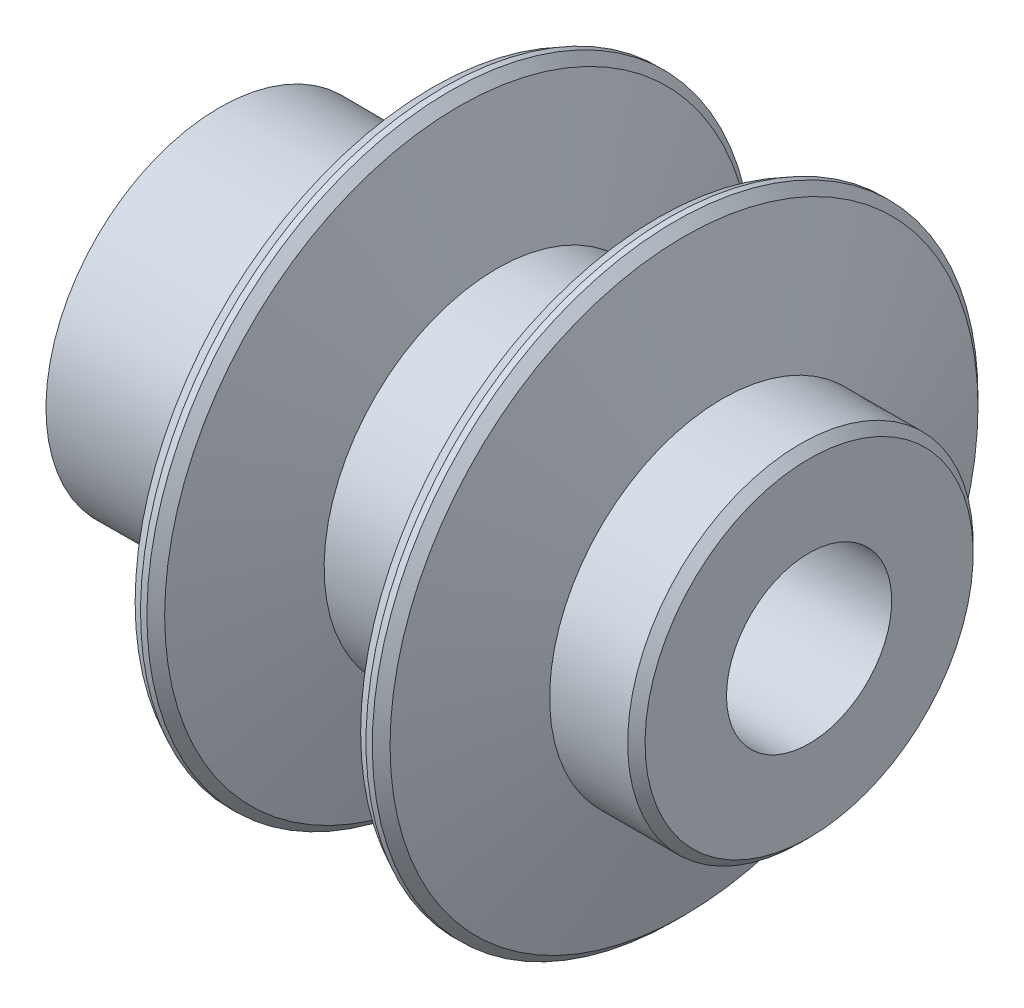
ISO-10303-21;
HEADER;
FILE_DESCRIPTION(('STEP AP214'),'2;1');
FILE_NAME('part.step','',(''),(''),'','','');
FILE_SCHEMA(('AUTOMOTIVE_DESIGN { 1 0 10303 214 1 1 1 1 }'));
ENDSEC;
DATA;
#1=APPLICATION_CONTEXT('core data for automotive mechanical design processes');
#2=APPLICATION_PROTOCOL_DEFINITION('international standard','automotive_design',2000,#1);
#3=PRODUCT_CONTEXT('',#1,'mechanical');
#4=PRODUCT('Part','Part','',(#3));
#5=PRODUCT_RELATED_PRODUCT_CATEGORY('part','',(#4));
#6=PRODUCT_DEFINITION_FORMATION('','',#4);
#7=PRODUCT_DEFINITION_CONTEXT('part definition',#1,'design');
#8=PRODUCT_DEFINITION('design','',#6,#7);
#9=PRODUCT_DEFINITION_SHAPE('','',#8);
#10=(LENGTH_UNIT() NAMED_UNIT(*) SI_UNIT(.MILLI.,.METRE.));
#11=(NAMED_UNIT(*) PLANE_ANGLE_UNIT() SI_UNIT($,.RADIAN.));
#12=(NAMED_UNIT(*) SI_UNIT($,.STERADIAN.) SOLID_ANGLE_UNIT());
#13=UNCERTAINTY_MEASURE_WITH_UNIT(LENGTH_MEASURE(1.E-05),#10,'distance_accuracy_value','');
#14=(GEOMETRIC_REPRESENTATION_CONTEXT(3) GLOBAL_UNCERTAINTY_ASSIGNED_CONTEXT((#13)) GLOBAL_UNIT_ASSIGNED_CONTEXT((#10,
#11,#12)) REPRESENTATION_CONTEXT('',''));
#15=CARTESIAN_POINT('',(0.,0.,0.));
#16=DIRECTION('',(0.,0.,1.));
#17=DIRECTION('',(1.,0.,0.));
#18=AXIS2_PLACEMENT_3D('',#15,#16,#17);
#19=CARTESIAN_POINT('',(-45.4027060929617,10.261092972109,0.));
#20=DIRECTION('',(0.99999999089214,0.000134965623412238,0.));
#21=DIRECTION('',(-0.000134965623412238,0.99999999089214,0.));
#22=AXIS2_PLACEMENT_3D('',#19,#20,#21);
#23=CONICAL_SURFACE('',#22,19.9999998178471,1.57066136117108);
#24=CARTESIAN_POINT('',(-45.4027060929617,10.261092972109,0.));
#25=DIRECTION('',(0.99999999089214,0.000134965623412238,0.));
#26=DIRECTION('',(-0.000134965623412238,0.99999999089214,0.));
#27=AXIS2_PLACEMENT_3D('',#24,#25,#26);
#28=CIRCLE('',#27,19.9999998178471);
#29=CARTESIAN_POINT('',(-45.4054054054054,30.2610926077989,0.));
#30=VERTEX_POINT('',#29);
#31=EDGE_CURVE('E80',#30,#30,#28,.T.);
#32=ORIENTED_EDGE('',*,*,#31,.F.);
#33=EDGE_LOOP('',(#32));
#34=FACE_BOUND('',#33,.T.);
#35=CARTESIAN_POINT('',(-45.4030737646995,2.51028127781917,-5.53629377175055));
#36=CARTESIAN_POINT('',(-45.403094757583,2.66582371932719,-5.7540564947995));
#37=CARTESIAN_POINT('',(-45.4031169875221,2.83053186984287,-5.9652335591642));
#38=CARTESIAN_POINT('',(-45.4031637751912,3.17719545691837,-6.37304072005153));
#39=CARTESIAN_POINT('',(-45.4031883335321,3.35915542005099,-6.56966697446681));
#40=CARTESIAN_POINT('',(-45.4032396245651,3.73918575412125,-6.94709710749086));
#41=CARTESIAN_POINT('',(-45.4032663595472,3.9372730919732,-7.12788389601905));
#42=CARTESIAN_POINT('',(-45.403321791674,4.34798600700947,-7.47212087167371));
#43=CARTESIAN_POINT('',(-45.4033504888534,4.56061184140798,-7.6355707519461));
#44=CARTESIAN_POINT('',(-45.4034096259314,4.99877582943607,-7.94388912346982));
#45=CARTESIAN_POINT('',(-45.4034400649606,5.22430754107116,-8.08876677007018));
#46=CARTESIAN_POINT('',(-45.4035024827213,5.68677907162685,-8.35900765826846));
#47=CARTESIAN_POINT('',(-45.4035344614771,5.92371907064133,-8.48437059167025));
#48=CARTESIAN_POINT('',(-45.4035997227812,6.40725925021572,-8.71465931155335));
#49=CARTESIAN_POINT('',(-45.4036330050066,6.65385703850355,-8.8195901211724));
#50=CARTESIAN_POINT('',(-45.4037006433634,7.15500950129093,-9.00830522172377));
#51=CARTESIAN_POINT('',(-45.403734999472,7.40956400586544,-9.09208996390897));
#52=CARTESIAN_POINT('',(-45.4038045460873,7.92485531718505,-9.23792872252882));
#53=CARTESIAN_POINT('',(-45.4038397366896,8.18559283154042,-9.29998023877936));
#54=CARTESIAN_POINT('',(-45.4039106983418,8.7113685679401,-9.40189807017984));
#55=CARTESIAN_POINT('',(-45.4039464693923,8.97640679434254,-9.44176436284696));
#56=CARTESIAN_POINT('',(-45.4040183390069,9.50890989112152,-9.4990293531274));
#57=CARTESIAN_POINT('',(-45.4040544375836,9.77637485555073,-9.51642717615611));
#58=CARTESIAN_POINT('',(-45.4041267042188,10.3118195960846,-9.52862866563136));
#59=CARTESIAN_POINT('',(-45.4041628722773,10.5797993720884,-9.5234323365014));
#60=CARTESIAN_POINT('',(-45.4042350200699,11.1143635734892,-9.4904827837582));
#61=CARTESIAN_POINT('',(-45.4042709998074,11.3809480246983,-9.46272997891086));
#62=CARTESIAN_POINT('',(-45.4043425158413,11.9108313411168,-9.38486531181616));
#63=CARTESIAN_POINT('',(-45.4043780521377,12.1741302062658,-9.33475344915659));
#64=CARTESIAN_POINT('',(-45.4044484285746,12.6955699150398,-9.21252705620526));
#65=CARTESIAN_POINT('',(-45.4044832687167,12.9537107690989,-9.14041257042716));
#66=CARTESIAN_POINT('',(-45.4045520052273,13.4629997815399,-8.97469358643707));
#67=CARTESIAN_POINT('',(-45.4045859015958,13.7141479399298,-8.8810890882499));
#68=CARTESIAN_POINT('',(-45.4046525096404,14.2076665234775,-8.67305535102246));
#69=CARTESIAN_POINT('',(-45.4046852213143,14.4500369318717,-8.55862607221405));
#70=CARTESIAN_POINT('',(-45.4047492273408,14.9242763986454,-8.30975641802208));
#71=CARTESIAN_POINT('',(-45.4047805216934,15.156145457028,-8.17531604264423));
#72=CARTESIAN_POINT('',(-45.4048414705377,15.6077333629814,-7.88738024761729));
#73=CARTESIAN_POINT('',(-45.4048711250324,15.8274522324759,-7.73388486235241));
#74=CARTESIAN_POINT('',(-45.4049285833966,16.2531781454162,-7.4089301147263));
#75=CARTESIAN_POINT('',(-45.404956387266,16.4591851888786,-7.23747075238695));
#76=CARTESIAN_POINT('',(-45.4050099467212,16.8560229388731,-6.87780695543337));
#77=CARTESIAN_POINT('',(-45.4050357023061,17.0468536398268,-6.68960251466423));
#78=CARTESIAN_POINT('',(-45.4050849820741,17.4119819302732,-6.29778663389506));
#79=CARTESIAN_POINT('',(-45.4051085062572,17.586279519744,-6.0941751938747));
#80=CARTESIAN_POINT('',(-45.4051531560027,17.9171026117396,-5.67299264580523));
#81=CARTESIAN_POINT('',(-45.4051742815624,18.0736280954866,-5.45542152300689));
#82=CARTESIAN_POINT('',(-45.4052139838422,18.3677939598887,-5.00786660447967));
#83=CARTESIAN_POINT('',(-45.4052325605622,18.5054343405343,-4.77788280874449));
#84=CARTESIAN_POINT('',(-45.4052670330871,18.7608514141752,-4.30713767201588));
#85=CARTESIAN_POINT('',(-45.405282928893,18.8786281138192,-4.06637633462997));
#86=CARTESIAN_POINT('',(-45.4053119265876,19.093480559322,-3.57578771265257));
#87=CARTESIAN_POINT('',(-45.4053250284763,19.190556305196,-3.32596042806774));
#88=CARTESIAN_POINT('',(-45.4053483451852,19.3633166575163,-2.81901613740866));
#89=CARTESIAN_POINT('',(-45.4053585600065,19.4390012726286,-2.56189913428761));
#90=CARTESIAN_POINT('',(-45.4053760299666,19.5684413437185,-2.04220325681223));
#91=CARTESIAN_POINT('',(-45.4053832851053,19.6221967996988,-1.77962438245855));
#92=CARTESIAN_POINT('',(-45.4053947841211,19.7073963890895,-1.25087150594821));
#93=CARTESIAN_POINT('',(-45.4053990279978,19.7388405196073,-0.984697503325427));
#94=CARTESIAN_POINT('',(-45.4054044743167,19.779193897851,-0.450646741045923));
#95=CARTESIAN_POINT('',(-45.4054056767589,19.7881031455715,-0.182769981388778));
#96=CARTESIAN_POINT('',(-45.40540503166,19.7833234184803,0.352781886933116));
#97=CARTESIAN_POINT('',(-45.4054031841186,19.769634440714,0.620456995571493));
#98=CARTESIAN_POINT('',(-45.4053964521867,19.7197555774943,1.15370251684772));
#99=CARTESIAN_POINT('',(-45.4053915677962,19.6835656920403,1.4192729294855));
#100=CARTESIAN_POINT('',(-45.4053787968915,19.5889423040728,1.94642099988044));
#101=CARTESIAN_POINT('',(-45.4053709103775,19.5305088025799,2.20799865782078));
#102=CARTESIAN_POINT('',(-45.4053521912941,19.3918136096325,2.72530157077349));
#103=CARTESIAN_POINT('',(-45.4053413587248,19.3115519181798,2.98102682578633));
#104=CARTESIAN_POINT('',(-45.4053168245444,19.129770962005,3.48480686812141));
#105=CARTESIAN_POINT('',(-45.4053031229336,19.0282516982411,3.73286165578941));
#106=CARTESIAN_POINT('',(-45.4052729480801,18.804677336399,4.21953725467747));
#107=CARTESIAN_POINT('',(-45.4052564748375,18.6826222383212,4.45815806589776));
#108=CARTESIAN_POINT('',(-45.4052208738355,18.4188439460777,4.92426926167932));
#109=CARTESIAN_POINT('',(-45.405201746076,18.2771207518553,5.15175964620856));
#110=CARTESIAN_POINT('',(-45.4051609720271,17.9750138345718,5.59399266765372));
#111=CARTESIAN_POINT('',(-45.4051393257376,17.8146301115102,5.80873530456929));
#112=CARTESIAN_POINT('',(-45.4050936685199,17.4763423610621,6.22394614878832));
#113=CARTESIAN_POINT('',(-45.4050696575915,17.2984383328852,6.42441435544792));
#114=CARTESIAN_POINT('',(-45.4050194418,16.9263747693751,6.80965111965927));
#115=CARTESIAN_POINT('',(-45.4049932369369,16.7322152340405,6.99441967720971));
#116=CARTESIAN_POINT('',(-45.4049388195754,16.3290210040934,7.34694355834154));
#117=CARTESIAN_POINT('',(-45.404910607077,16.1199863087317,7.51469888106593));
#118=CARTESIAN_POINT('',(-45.4048523750201,15.6885278790457,7.83200364200228));
#119=CARTESIAN_POINT('',(-45.4048223554616,15.4661041447219,7.9815530802148));
#120=CARTESIAN_POINT('',(-45.4047607227097,15.0094489666934,8.26138284683793));
#121=CARTESIAN_POINT('',(-45.4047291095165,14.7752175245324,8.39166317776779));
#122=CARTESIAN_POINT('',(-45.4046645142424,14.2966121490654,8.63202853823916));
#123=CARTESIAN_POINT('',(-45.4046315321615,14.0522382157619,8.74211356778563));
#124=CARTESIAN_POINT('',(-45.4045644335991,13.5550852419095,8.94130567427798));
#125=CARTESIAN_POINT('',(-45.4045303171177,13.3023062024397,9.03041275391717));
#126=CARTESIAN_POINT('',(-45.404461192298,12.7901400932492,9.18701548114189));
#127=CARTESIAN_POINT('',(-45.4044261839596,12.5307530235275,9.25451112872477));
#128=CARTESIAN_POINT('',(-45.4043555242998,12.0072148335738,9.36741116131099));
#129=CARTESIAN_POINT('',(-45.404319872978,11.7430637114117,9.41281553736489));
#130=CARTESIAN_POINT('',(-45.4042481808249,11.2118754756744,9.4812101880904));
#131=CARTESIAN_POINT('',(-45.4042121399934,10.944838362097,9.50420046274556));
#132=CARTESIAN_POINT('',(-45.4041399250377,10.4097765293485,9.52760346738028));
#133=CARTESIAN_POINT('',(-45.4041037509133,10.1417518098493,9.52801618985955));
#134=CARTESIAN_POINT('',(-45.4040315265603,9.6066203508181,9.50626113700611));
#135=CARTESIAN_POINT('',(-45.4039954763317,9.33951361128573,9.48409336168486));
#136=CARTESIAN_POINT('',(-45.4039237561038,8.80811736400552,9.4173349483631));
#137=CARTESIAN_POINT('',(-45.4038880861041,8.54382785328131,9.37274433405449));
#138=CARTESIAN_POINT('',(-45.4038173798876,8.0199447149835,9.26145726712772));
#139=CARTESIAN_POINT('',(-45.4037823436707,7.76035108740369,9.19476081453883));
#140=CARTESIAN_POINT('',(-45.4037131541187,7.24770536397686,9.03973627125231));
#141=CARTESIAN_POINT('',(-45.4036790007834,6.99465326569139,8.95140818861831));
#142=CARTESIAN_POINT('',(-45.4036118197903,6.4968895456792,8.75374833099488));
#143=CARTESIAN_POINT('',(-45.4035787921326,6.25217792396261,8.64441655597991));
#144=CARTESIAN_POINT('',(-45.4035140972428,5.77283447438718,8.40552637981803));
#145=CARTESIAN_POINT('',(-45.4034824300132,5.53820266471732,8.27596794217412));
#146=CARTESIAN_POINT('',(-45.4034206811784,5.08068740311404,7.99754566787315));
#147=CARTESIAN_POINT('',(-45.4033905995733,4.85780395118392,7.84868183121066));
#148=CARTESIAN_POINT('',(-45.4033322359059,4.42537039026196,7.53270739638794));
#149=CARTESIAN_POINT('',(-45.4033039538403,4.21582025573391,7.36559683317582));
#150=CARTESIAN_POINT('',(-45.4032493902573,3.81154263678411,7.01431676583025));
#151=CARTESIAN_POINT('',(-45.4032231087399,3.61681515237941,6.83014726167716));
#152=CARTESIAN_POINT('',(-45.4031727330479,3.24356684890642,6.44605825547448));
#153=CARTESIAN_POINT('',(-45.4031486388777,3.06504606262618,6.24613872156226));
#154=CARTESIAN_POINT('',(-45.4031028092359,2.72548078138441,5.83197129710767));
#155=CARTESIAN_POINT('',(-45.4030810737643,2.56443628610066,5.6177234068295));
#156=CARTESIAN_POINT('',(-45.4030401156652,2.26096569597363,5.1764183432156));
#157=CARTESIAN_POINT('',(-45.4030208930843,2.1185399467729,4.94936093219308));
#158=CARTESIAN_POINT('',(-45.4029850979034,1.85332293481566,4.48405470800198));
#159=CARTESIAN_POINT('',(-45.4029685253039,1.73053167590312,4.24580589264241));
#160=CARTESIAN_POINT('',(-45.4029381485078,1.50546106918331,3.75982024607018));
#161=CARTESIAN_POINT('',(-45.4029243442035,1.40318092319154,3.51208378451375));
#162=CARTESIAN_POINT('',(-45.4028996013393,1.21985377269812,3.00887555235811));
#163=CARTESIAN_POINT('',(-45.4028886627764,1.13880674667868,2.7534037895982));
#164=CARTESIAN_POINT('',(-45.40286973023,0.998529948043019,2.23657064577719));
#165=CARTESIAN_POINT('',(-45.402861735908,0.939297667761671,1.97520994533336));
#166=CARTESIAN_POINT('',(-45.4028487467561,0.843057225260696,1.44842255267739));
#167=CARTESIAN_POINT('',(-45.4028437519902,0.806049537376598,1.18299577380764));
#168=CARTESIAN_POINT('',(-45.4028367968657,0.754516976990006,0.649902541356219));
#169=CARTESIAN_POINT('',(-45.4028348372546,0.739997642381337,0.382235552419567));
#170=CARTESIAN_POINT('',(-45.4028339687266,0.733562463632602,-0.153365644252848));
#171=CARTESIAN_POINT('',(-45.4028350597616,0.741646262560721,-0.421299847702171));
#172=CARTESIAN_POINT('',(-45.4028402859876,0.780368906351694,-0.955667186808613));
#173=CARTESIAN_POINT('',(-45.4028444226856,0.811018916493242,-1.22209951358983));
#174=CARTESIAN_POINT('',(-45.4028557123142,0.894667092141308,-1.75142660780409));
#175=CARTESIAN_POINT('',(-45.4028628651916,0.94766486216087,-2.01432143775504));
#176=CARTESIAN_POINT('',(-45.4028801274317,1.07556587008988,-2.53443477894393));
#177=CARTESIAN_POINT('',(-45.402890233638,1.15044572155418,-2.79165903658473));
#178=CARTESIAN_POINT('',(-45.4029133291722,1.3215673195067,-3.29880765042695));
#179=CARTESIAN_POINT('',(-45.402926317741,1.41780344171262,-3.54873390902003));
#180=CARTESIAN_POINT('',(-45.4029586730364,1.65753333128402,-4.10073641131244));
#181=CARTESIAN_POINT('',(-45.4029788226328,1.80682761143724,-4.40031281790049));
#182=CARTESIAN_POINT('',(-45.4030232599329,2.13607662346845,-4.98211448869472));
#183=CARTESIAN_POINT('',(-45.4030475476365,2.31603135534617,-5.26433975290104));
#184=CARTESIAN_POINT('',(-45.4030737646995,2.51028127781917,-5.53629377175055));
#185=B_SPLINE_CURVE_WITH_KNOTS('',3,(#35,#36,#37,#38,#39,#40,#41,#42,#43,#44,#45,#46,#47,#48,
#49,#50,#51,#52,#53,#54,#55,#56,#57,#58,#59,#60,#61,#62,#63,#64,#65,#66,#67,#68,#69,#70,#71,#72,
#73,#74,#75,#76,#77,#78,#79,#80,#81,#82,#83,#84,#85,#86,#87,#88,#89,#90,#91,#92,#93,#94,#95,#96,
#97,#98,#99,#100,#101,#102,#103,#104,#105,#106,#107,#108,#109,#110,#111,#112,#113,#114,#115,
#116,#117,#118,#119,#120,#121,#122,#123,#124,#125,#126,#127,#128,#129,#130,#131,#132,#133,#134,
#135,#136,#137,#138,#139,#140,#141,#142,#143,#144,#145,#146,#147,#148,#149,#150,#151,#152,#153,
#154,#155,#156,#157,#158,#159,#160,#161,#162,#163,#164,#165,#166,#167,#168,#169,#170,#171,#172,
#173,#174,#175,#176,#177,#178,#179,#180,#181,#182,#183,#184),.UNSPECIFIED.,.T.,.F.,(4,2,2,2,2,2,
2,2,2,2,2,2,2,2,2,2,2,2,2,2,2,2,2,2,2,2,2,2,2,2,2,2,2,2,2,2,2,2,2,2,2,2,2,2,2,2,2,2,2,2,2,2,2,2,
2,2,2,2,2,2,2,2,2,2,2,2,2,2,2,2,2,2,2,2,4),(0.,0.802532149334454,1.6052754548481,
2.40887448425916,3.21248773457417,4.01570330056762,4.81893155046903,5.62196208062227,
6.42497547281391,7.22808121311841,8.03118776730027,8.8343255814422,9.63746323834596,
10.4405859851645,11.2437087467896,12.0468298836224,12.8499510195278,13.653073689133,
14.4561963585088,15.2593175786938,16.0624387979001,16.8655603123074,17.6686818277752,
18.471804191802,19.2749265562358,20.0780486518455,20.8811707468634,21.6842925165246,
22.4874142860892,23.29053615978,24.0936580336679,24.8967800125686,25.699901991497,
26.5030239335806,27.3061458755991,28.1092677814138,28.9123896872097,29.715511595318,
30.5186335034484,31.3217554478038,32.1248773922265,32.9279993771054,33.7311213619596,
34.5342432418128,35.3373651214691,36.1404868980143,36.9436086746577,37.746730776655,
38.5498528792421,39.3529752486275,40.156097617605,40.9592191380074,41.7623406573463,
42.565461877305,43.3685830982395,44.1717057683427,44.9748284386721,45.7779495708014,
46.5810707038547,47.3841934616805,48.1873162046983,48.9904538549489,49.7935916624351,
50.5966982099597,51.3998039436074,52.2028173292021,53.0058478527599,53.809076096047,
54.6122916554248,55.4159048959808,56.2195039156387,57.0222472114499,57.8247793510958,
58.8270254665628,59.8292715820211),.UNSPECIFIED.);
#186=CARTESIAN_POINT('',(-45.4030737646995,2.51028127781917,-5.53629377175055));
#187=VERTEX_POINT('',#186);
#188=EDGE_CURVE('E88',#187,#187,#185,.T.);
#189=ORIENTED_EDGE('',*,*,#188,.T.);
#190=EDGE_LOOP('',(#189));
#191=FACE_BOUND('',#190,.T.);
#192=ADVANCED_FACE('F42',(#34,#191),#23,.T.);
#193=CARTESIAN_POINT('',(22.5945945946021,10.2702702702703,0.));
#194=DIRECTION('',(0.99999999089214,0.000134965623412238,0.));
#195=DIRECTION('',(-0.000134965623412238,0.99999999089214,0.));
#196=AXIS2_PLACEMENT_3D('',#193,#194,#195);
#197=CONICAL_SURFACE('',#196,0.,1.57066136117107);
#198=CARTESIAN_POINT('',(22.5971481527377,10.2702706149128,0.));
#199=DIRECTION('',(-0.99999999089214,-0.000134965623409413,0.));
#200=DIRECTION('',(0.000134965623409413,-0.99999999089214,0.));
#201=AXIS2_PLACEMENT_3D('',#198,#199,#200);
#202=CIRCLE('',#201,18.9200632795988);
#203=CARTESIAN_POINT('',(22.5997017108731,-8.64979249236463,0.));
#204=VERTEX_POINT('',#203);
#205=EDGE_CURVE('E77',#204,#204,#202,.F.);
#206=ORIENTED_EDGE('',*,*,#205,.T.);
#207=EDGE_LOOP('',(#206));
#208=FACE_BOUND('',#207,.T.);
#209=CARTESIAN_POINT('',(22.5969284821206,2.51028127839455,-5.53629377256313));
#210=CARTESIAN_POINT('',(22.596949495638,2.35473571286341,-5.31853328302294));
#211=CARTESIAN_POINT('',(22.596969265962,2.20839248666329,-5.09423841748999));
#212=CARTESIAN_POINT('',(22.5970061919177,1.93506039358879,-4.63405162151986));
#213=CARTESIAN_POINT('',(22.5970233468601,1.80807662921729,-4.39815665527868));
#214=CARTESIAN_POINT('',(22.5970549288809,1.57430120961579,-3.91625872905726));
#215=CARTESIAN_POINT('',(22.597069353032,1.46753122345851,-3.6702452620231));
#216=CARTESIAN_POINT('',(22.597095348846,1.27510584342714,-3.17008862075407));
#217=CARTESIAN_POINT('',(22.5971069204584,1.18945082324096,-2.91594530272885));
#218=CARTESIAN_POINT('',(22.5971271233595,1.03990555169681,-2.40147070727027));
#219=CARTESIAN_POINT('',(22.5971357561005,0.976004550547644,-2.14114255432202));
#220=CARTESIAN_POINT('',(22.5971500279327,0.870362047144086,-1.61602379166266));
#221=CARTESIAN_POINT('',(22.5971556669766,0.828620894835386,-1.35123311154797));
#222=CARTESIAN_POINT('',(22.5971639100796,0.767604058311952,-0.819142005512789));
#223=CARTESIAN_POINT('',(22.5971665148855,0.748322846608333,-0.551842213426666));
#224=CARTESIAN_POINT('',(22.5971686734892,0.73234449857427,-0.0165741753385256));
#225=CARTESIAN_POINT('',(22.5971682273521,0.73564688027193,0.251394056275859));
#226=CARTESIAN_POINT('',(22.5971642871653,0.764812806397451,0.786130836622365));
#227=CARTESIAN_POINT('',(22.5971607927652,0.790678945056587,1.05289924386154));
#228=CARTESIAN_POINT('',(22.5971507804149,0.864792046956859,1.5833090950072));
#229=CARTESIAN_POINT('',(22.5971442624618,0.913039032878766,1.84695053574453));
#230=CARTESIAN_POINT('',(22.5971282490293,1.03157315426134,2.36924210368093));
#231=CARTESIAN_POINT('',(22.5971187534341,1.10186114753422,2.62789203619993));
#232=CARTESIAN_POINT('',(22.5970968523099,1.26397695024574,3.13835105073428));
#233=CARTESIAN_POINT('',(22.5970844467815,1.35580475546731,3.39016013408893));
#234=CARTESIAN_POINT('',(22.5970568142462,1.56034542160361,3.8851426240434));
#235=CARTESIAN_POINT('',(22.5970415872916,1.67305789467433,4.12831619091135));
#236=CARTESIAN_POINT('',(22.5970084200059,1.91856770422782,4.60430375191237));
#237=CARTESIAN_POINT('',(22.5969904796747,2.05136504108077,4.8371177458545));
#238=CARTESIAN_POINT('',(22.5969520132201,2.33610017633481,5.29073052416483));
#239=CARTESIAN_POINT('',(22.5969314871019,2.48803793601263,5.51152933283983));
#240=CARTESIAN_POINT('',(22.5968879949726,2.80997394333814,5.93954250468543));
#241=CARTESIAN_POINT('',(22.5968650289614,2.9799721909651,6.14675686787162));
#242=CARTESIAN_POINT('',(22.5968168202738,3.33682093338102,6.54612836496832));
#243=CARTESIAN_POINT('',(22.5967915775929,3.52367146046948,6.7382854700184));
#244=CARTESIAN_POINT('',(22.5967389950637,3.91289608642955,7.10617588565959));
#245=CARTESIAN_POINT('',(22.5967116552153,4.11527018529677,7.28190919625536));
#246=CARTESIAN_POINT('',(22.5966550727722,4.53410281537066,7.61570236094408));
#247=CARTESIAN_POINT('',(22.5966258301808,4.75056132116282,7.77376224692632));
#248=CARTESIAN_POINT('',(22.596565650104,5.1960242047366,8.07108521852539));
#249=CARTESIAN_POINT('',(22.5965347126185,5.42502858250308,8.21034830416491));
#250=CARTESIAN_POINT('',(22.5964713626877,5.89395521903926,8.46908764950222));
#251=CARTESIAN_POINT('',(22.5964389502418,6.13387748198602,8.58856390162973));
#252=CARTESIAN_POINT('',(22.5963728808335,6.62293410594971,8.80688011175901));
#253=CARTESIAN_POINT('',(22.5963392238711,6.87206846697887,8.90572006973337));
#254=CARTESIAN_POINT('',(22.5962709046742,7.37777836019957,9.08206109252418));
#255=CARTESIAN_POINT('',(22.5962362424385,7.63435390025351,9.15956213479284));
#256=CARTESIAN_POINT('',(22.5961661591569,8.15312179962689,9.29267420126831));
#257=CARTESIAN_POINT('',(22.5961307381109,8.41531415894923,9.34828522546378));
#258=CARTESIAN_POINT('',(22.5960593890423,8.94345158013681,9.43722188016634));
#259=CARTESIAN_POINT('',(22.59602346102,9.20939664080773,9.47054751776578));
#260=CARTESIAN_POINT('',(22.5959513534145,9.74314883546895,9.51467650221277));
#261=CARTESIAN_POINT('',(22.5959151738313,10.0109559694579,9.52547984907666));
#262=CARTESIAN_POINT('',(22.5958428203341,10.5465282532922,9.5244874469607));
#263=CARTESIAN_POINT('',(22.5958066464201,10.8142934031546,9.51269170713475));
#264=CARTESIAN_POINT('',(22.5957345614212,11.3478781783383,9.46658501037084));
#265=CARTESIAN_POINT('',(22.5956986503364,11.6136978036599,9.4322740534355));
#266=CARTESIAN_POINT('',(22.5956273462971,12.141501749347,9.34138084629172));
#267=CARTESIAN_POINT('',(22.5955919533428,12.4034860691741,9.28479859295746));
#268=CARTESIAN_POINT('',(22.5955219371927,12.9217568144609,9.14976505898251));
#269=CARTESIAN_POINT('',(22.5954873139968,13.1780432399192,9.07131377833628));
#270=CARTESIAN_POINT('',(22.5954190835094,13.6830961867633,8.8930999195739));
#271=CARTESIAN_POINT('',(22.595385476218,13.9318627071659,8.79333733867073));
#272=CARTESIAN_POINT('',(22.5953195164722,14.4201072277003,8.57321013772131));
#273=CARTESIAN_POINT('',(22.5952871640178,14.6595852278319,8.4528455176744));
#274=CARTESIAN_POINT('',(22.5952239439544,15.1275501517768,8.19236996480698));
#275=CARTESIAN_POINT('',(22.5951930763453,15.3560370760916,8.05225903288766));
#276=CARTESIAN_POINT('',(22.5951330454215,15.8003954548332,7.75328695693116));
#277=CARTESIAN_POINT('',(22.5951038821067,16.0162669092609,7.59442581289546));
#278=CARTESIAN_POINT('',(22.5950474671068,16.433859621993,7.25908272785214));
#279=CARTESIAN_POINT('',(22.5950202154216,16.6355808809356,7.08260078763929));
#280=CARTESIAN_POINT('',(22.5949678174229,17.0234390961132,6.71327078504906));
#281=CARTESIAN_POINT('',(22.5949426711094,17.2095760523487,6.5204227226722));
#282=CARTESIAN_POINT('',(22.5948946626298,17.5649423385474,6.11973151135712));
#283=CARTESIAN_POINT('',(22.5948718004637,17.7341716686366,5.91188836253058));
#284=CARTESIAN_POINT('',(22.5948285228154,18.0545195849778,5.48268461722353));
#285=CARTESIAN_POINT('',(22.5948081073332,18.2056381712295,5.26132402074271));
#286=CARTESIAN_POINT('',(22.594769868194,18.4886902436562,4.8066591110196));
#287=CARTESIAN_POINT('',(22.5947520445371,18.6206237289671,4.57335479723933));
#288=CARTESIAN_POINT('',(22.5947191157654,18.8643676232733,4.09646111605377));
#289=CARTESIAN_POINT('',(22.5947040106507,18.9761780322673,3.85287174864775));
#290=CARTESIAN_POINT('',(22.5946766263514,19.1788808722711,3.35713972634768));
#291=CARTESIAN_POINT('',(22.594664347167,19.2697733025696,3.10499707116276));
#292=CARTESIAN_POINT('',(22.594642702027,19.4299939894608,2.59395106461154));
#293=CARTESIAN_POINT('',(22.5946333360714,19.4993222460544,2.33504771324553));
#294=CARTESIAN_POINT('',(22.5946175839765,19.6159216954477,1.81232099652215));
#295=CARTESIAN_POINT('',(22.5946111978369,19.6631928911327,1.54849763180839));
#296=CARTESIAN_POINT('',(22.5946014507739,19.7353421622525,1.01780648133585));
#297=CARTESIAN_POINT('',(22.5945980898505,19.760220237693,0.750938695577835));
#298=CARTESIAN_POINT('',(22.5945944171146,19.7874063981881,0.216056011257466));
#299=CARTESIAN_POINT('',(22.5945941053016,19.7897144864843,-0.051958887140138));
#300=CARTESIAN_POINT('',(22.594596533002,19.7717442720231,-0.587230410282403));
#301=CARTESIAN_POINT('',(22.5945992725154,19.7514659692632,-0.854487035026979));
#302=CARTESIAN_POINT('',(22.594607783394,19.6884671264248,-1.38634208496859));
#303=CARTESIAN_POINT('',(22.5946135547605,19.6457465772559,-1.65094050908883));
#304=CARTESIAN_POINT('',(22.5946280883148,19.5381669537981,-2.17559791091736));
#305=CARTESIAN_POINT('',(22.5946368505028,19.473307879493,-2.43565688862232));
#306=CARTESIAN_POINT('',(22.5946573034093,19.3219122905254,-2.94938661669981));
#307=CARTESIAN_POINT('',(22.5946689941289,19.2353757688226,-3.20305736499757));
#308=CARTESIAN_POINT('',(22.594695220983,19.0412405190825,-3.70220709759813));
#309=CARTESIAN_POINT('',(22.5947097571175,18.933641791056,-3.94768608190514));
#310=CARTESIAN_POINT('',(22.5947415714411,18.6981472165711,-4.42870682193394));
#311=CARTESIAN_POINT('',(22.5947588496272,18.5702513915586,-4.66424858815513));
#312=CARTESIAN_POINT('',(22.5947960252274,18.2950718033776,-5.12372060816074));
#313=CARTESIAN_POINT('',(22.5948159226414,18.1477880402347,-5.3476508619605));
#314=CARTESIAN_POINT('',(22.5948581952305,17.8348797317287,-5.78230776887246));
#315=CARTESIAN_POINT('',(22.5948805704048,17.6692551931358,-5.99303442685851));
#316=CARTESIAN_POINT('',(22.5949276394463,17.3208427784908,-6.39978609486674));
#317=CARTESIAN_POINT('',(22.5949523333135,17.1380549024178,-6.59581110487107));
#318=CARTESIAN_POINT('',(22.5950038642289,16.7566149783596,-6.97176619836585));
#319=CARTESIAN_POINT('',(22.595030701281,16.5579629017487,-7.151696252813));
#320=CARTESIAN_POINT('',(22.5950863277311,16.1462071635129,-7.49418184043744));
#321=CARTESIAN_POINT('',(22.5951151171292,15.9331035018838,-7.65673737360966));
#322=CARTESIAN_POINT('',(22.5951744435389,15.4939600538077,-7.96331795239893));
#323=CARTESIAN_POINT('',(22.5952049805472,15.2679202919682,-8.10734303326349));
#324=CARTESIAN_POINT('',(22.5952675851274,14.8045112786015,-8.37583914006655));
#325=CARTESIAN_POINT('',(22.5952996526993,14.5671420270612,-8.50031016598242));
#326=CARTESIAN_POINT('',(22.5953650904919,14.0827610933913,-8.7288134814631));
#327=CARTESIAN_POINT('',(22.5953984607153,13.8357493917547,-8.83284572967695));
#328=CARTESIAN_POINT('',(22.5954662665061,13.3338401242223,-9.01973156513365));
#329=CARTESIAN_POINT('',(22.5955007020736,13.0789425584719,-9.10258515276674));
#330=CARTESIAN_POINT('',(22.5955703943841,12.5630689335315,-9.2465259673765));
#331=CARTESIAN_POINT('',(22.5956056511425,12.3020927615008,-9.30761278994));
#332=CARTESIAN_POINT('',(22.5956767345605,11.7759218974123,-9.40758362821153));
#333=CARTESIAN_POINT('',(22.5957125612203,11.5107272045286,-9.44646763957251));
#334=CARTESIAN_POINT('',(22.5957845283154,10.9780151801949,-9.50175530878429));
#335=CARTESIAN_POINT('',(22.5958206687386,10.7104979395488,-9.5181598415615));
#336=CARTESIAN_POINT('',(22.5958930077759,10.1750326981116,-9.52837475411392));
#337=CARTESIAN_POINT('',(22.5959292063901,9.90708469775733,-9.52218515678612));
#338=CARTESIAN_POINT('',(22.5960014003505,9.37269329869258,-9.48725787300247));
#339=CARTESIAN_POINT('',(22.5960373957196,9.10624973053193,-9.45852277910585));
#340=CARTESIAN_POINT('',(22.5961089323157,8.57672420765957,-9.37871107627567));
#341=CARTESIAN_POINT('',(22.596144473533,8.31364232481301,-9.327633990541));
#342=CARTESIAN_POINT('',(22.5962148571001,7.79265167162122,-9.20348590937001));
#343=CARTESIAN_POINT('',(22.5962496992756,7.53474419093294,-9.13040950175584));
#344=CARTESIAN_POINT('',(22.5963184274055,7.02600731663247,-8.96278834010854));
#345=CARTESIAN_POINT('',(22.5963523133749,6.77517781131335,-8.86824392510381));
#346=CARTESIAN_POINT('',(22.5964189052406,6.28225387864835,-8.6583060724969));
#347=CARTESIAN_POINT('',(22.5964516105444,6.0401638376601,-8.54290233540407));
#348=CARTESIAN_POINT('',(22.596515589894,5.56657814601578,-8.29210202986029));
#349=CARTESIAN_POINT('',(22.5965468639651,5.33508230795504,-8.15670581524268));
#350=CARTESIAN_POINT('',(22.5966077269275,4.88456459869887,-7.86703296472087));
#351=CARTESIAN_POINT('',(22.5966373175777,4.66552970692359,-7.7127765874328));
#352=CARTESIAN_POINT('',(22.596694630032,4.24129341793853,-7.38642416946216));
#353=CARTESIAN_POINT('',(22.5967223523256,4.0360883970774,-7.21433283205509));
#354=CARTESIAN_POINT('',(22.5967823907388,3.59167408644958,-6.80853346440462));
#355=CARTESIAN_POINT('',(22.596814133248,3.35671075541729,-6.57014921978572));
#356=CARTESIAN_POINT('',(22.5968740575224,2.91314126834624,-6.07000499561775));
#357=CARTESIAN_POINT('',(22.5969022392876,2.70453511230756,-5.80824501606861));
#358=CARTESIAN_POINT('',(22.5969284821206,2.51028127839455,-5.53629377256313));
#359=B_SPLINE_CURVE_WITH_KNOTS('',3,(#209,#210,#211,#212,#213,#214,#215,#216,#217,#218,#219,
#220,#221,#222,#223,#224,#225,#226,#227,#228,#229,#230,#231,#232,#233,#234,#235,#236,#237,#238,
#239,#240,#241,#242,#243,#244,#245,#246,#247,#248,#249,#250,#251,#252,#253,#254,#255,#256,#257,
#258,#259,#260,#261,#262,#263,#264,#265,#266,#267,#268,#269,#270,#271,#272,#273,#274,#275,#276,
#277,#278,#279,#280,#281,#282,#283,#284,#285,#286,#287,#288,#289,#290,#291,#292,#293,#294,#295,
#296,#297,#298,#299,#300,#301,#302,#303,#304,#305,#306,#307,#308,#309,#310,#311,#312,#313,#314,
#315,#316,#317,#318,#319,#320,#321,#322,#323,#324,#325,#326,#327,#328,#329,#330,#331,#332,#333,
#334,#335,#336,#337,#338,#339,#340,#341,#342,#343,#344,#345,#346,#347,#348,#349,#350,#351,#352,
#353,#354,#355,#356,#357,#358),.UNSPECIFIED.,.T.,.F.,(4,2,2,2,2,2,2,2,2,2,2,2,2,2,2,2,2,2,2,2,2,
2,2,2,2,2,2,2,2,2,2,2,2,2,2,2,2,2,2,2,2,2,2,2,2,2,2,2,2,2,2,2,2,2,2,2,2,2,2,2,2,2,2,2,2,2,2,2,2,
2,2,2,2,2,4),(0.,0.802532144293231,1.60527544474005,2.40887446898114,3.2124877141165,
4.01570327380769,4.81893151740617,5.62196204125491,6.42497542713412,7.22808115034223,
8.03118768742014,8.83432548441765,9.637463124177,10.4405858505602,11.2437085917462,
12.0468297081494,12.849950823631,13.6530734784274,14.4561961329966,15.2593173384166,
16.0624385428669,16.8655600545847,17.6686815673699,18.471803928771,19.2749262905873,
20.0780483968082,20.8811705024463,21.684292282775,22.4874140630109,23.2905359559665,
24.0936578491261,24.8967798473153,25.6999018455302,26.5030238070922,27.306145768591,
28.1092676938651,28.9123896191131,29.71551153838,30.518633457665,31.3217554131254,
32.124877368644,32.9279993514744,33.7311213342718,34.534243212012,35.3373650895482,
36.1404868517386,36.9436086140185,37.7467307016137,38.5498527897969,39.3529751388155,
40.1560974874207,40.9592189874471,41.762340486414,42.5654616889229,43.3685828924079,
44.171705545094,44.9748281980146,45.7779493232617,46.5810704494385,47.3841932004426,
48.1873159366476,48.9904535936029,49.7935914078027,50.5966979620936,51.3998037025132,
52.2028171054633,53.0058476463816,53.8090759070632,54.6122914838351,55.4159047448161,
56.2195037848938,57.0222471010891,57.8247792611101,58.8270254218062,59.8292715825055),.UNSPECIFIED.);
#360=CARTESIAN_POINT('',(22.5969284821206,2.51028127839455,-5.53629377256313));
#361=VERTEX_POINT('',#360);
#362=EDGE_CURVE('E81',#361,#361,#359,.T.);
#363=ORIENTED_EDGE('',*,*,#362,.T.);
#364=EDGE_LOOP('',(#363));
#365=FACE_BOUND('',#364,.T.);
#366=ADVANCED_FACE('F90',(#208,#365),#197,.F.);
#367=CARTESIAN_POINT('',(-25.4027160072856,10.2637922832638,0.));
#368=DIRECTION('',(-0.99999999089214,-0.000134965623412238,0.));
#369=DIRECTION('',(0.000134965623412238,-0.99999999089214,0.));
#370=AXIS2_PLACEMENT_3D('',#367,#368,#369);
#371=CONICAL_SURFACE('',#370,19.9265416204147,0.00367289514281781);
#372=ORIENTED_EDGE('',*,*,#31,.T.);
#373=EDGE_LOOP('',(#372));
#374=FACE_BOUND('',#373,.T.);
#375=CARTESIAN_POINT('',(-25.4027160072856,10.2637922832638,0.));
#376=DIRECTION('',(0.99999999089214,0.000134965623412238,0.));
#377=DIRECTION('',(-0.000134965623412238,0.99999999089214,0.));
#378=AXIS2_PLACEMENT_3D('',#375,#376,#377);
#379=CIRCLE('',#378,19.9265416204147);
#380=CARTESIAN_POINT('',(-25.4054054053979,30.1903337221904,0.));
#381=VERTEX_POINT('',#380);
#382=EDGE_CURVE('E149',#381,#381,#379,.T.);
#383=ORIENTED_EDGE('',*,*,#382,.F.);
#384=EDGE_LOOP('',(#383));
#385=FACE_BOUND('',#384,.T.);
#386=ADVANCED_FACE('F113',(#374,#385),#371,.T.);
#387=CARTESIAN_POINT('',(-20.6506916094775,10.2644336432049,0.));
#388=DIRECTION('',(0.99999999089214,0.000134965623412238,0.));
#389=DIRECTION('',(-0.000134965623412238,0.99999999089214,0.));
#390=AXIS2_PLACEMENT_3D('',#387,#388,#389);
#391=CONICAL_SURFACE('',#390,34.9259003970788,1.26398504176926);
#392=CARTESIAN_POINT('',(-20.8621058668129,10.2644051095476,0.));
#393=DIRECTION('',(-0.99999999089214,-0.000134965623414316,0.));
#394=DIRECTION('',(0.000134965623414316,-0.99999999089214,0.));
#395=AXIS2_PLACEMENT_3D('',#392,#393,#394);
#396=CIRCLE('',#395,34.2585893669129);
#397=CARTESIAN_POINT('',(-20.8574821349417,-23.9941839453428,0.));
#398=VERTEX_POINT('',#397);
#399=EDGE_CURVE('E62',#398,#398,#396,.T.);
#400=ORIENTED_EDGE('',*,*,#399,.T.);
#401=EDGE_LOOP('',(#400));
#402=FACE_BOUND('',#401,.T.);
#403=ORIENTED_EDGE('',*,*,#382,.T.);
#404=EDGE_LOOP('',(#403));
#405=FACE_BOUND('',#404,.T.);
#406=ADVANCED_FACE('F168',(#402,#405),#391,.T.);
#407=CARTESIAN_POINT('',(-18.1351387575272,10.2647731563669,0.));
#408=DIRECTION('',(-0.99999999089214,-0.000134965623412238,0.));
#409=DIRECTION('',(0.000134965623412238,-0.99999999089214,0.));
#410=AXIS2_PLACEMENT_3D('',#407,#408,#409);
#411=CONICAL_SURFACE('',#410,34.9255608839137,0.000134965623822198);
#412=CARTESIAN_POINT('',(-18.8351387447483,10.2646786804314,0.));
#413=DIRECTION('',(0.99999999089214,0.000134965623411032,0.));
#414=DIRECTION('',(-0.000134965623411032,0.99999999089214,0.));
#415=AXIS2_PLACEMENT_3D('',#412,#413,#414);
#416=CIRCLE('',#415,34.9256553598501);
#417=CARTESIAN_POINT('',(-18.839852507597,45.1903337221835,0.));
#418=VERTEX_POINT('',#417);
#419=EDGE_CURVE('E65',#418,#418,#416,.F.);
#420=ORIENTED_EDGE('',*,*,#419,.T.);
#421=EDGE_LOOP('',(#420));
#422=FACE_BOUND('',#421,.T.);
#423=CARTESIAN_POINT('',(-19.5761664306815,10.2645786671669,0.));
#424=DIRECTION('',(0.99999999089214,0.000134965623414316,0.));
#425=DIRECTION('',(-0.000134965623414316,0.99999999089214,0.));
#426=AXIS2_PLACEMENT_3D('',#423,#424,#425);
#427=CIRCLE('',#426,34.9257553731155);
#428=CARTESIAN_POINT('',(-19.5808802070286,45.1903337221835,0.));
#429=VERTEX_POINT('',#428);
#430=EDGE_CURVE('E68',#429,#429,#427,.T.);
#431=ORIENTED_EDGE('',*,*,#430,.T.);
#432=EDGE_LOOP('',(#431));
#433=FACE_BOUND('',#432,.T.);
#434=ADVANCED_FACE('F174',(#422,#433),#411,.T.);
#435=CARTESIAN_POINT('',(-13.4027162258743,10.26541187073,0.));
#436=DIRECTION('',(-0.99999999089214,-0.000134965623412238,0.));
#437=DIRECTION('',(0.000134965623412238,-0.99999999089214,0.));
#438=AXIS2_PLACEMENT_3D('',#435,#436,#437);
#439=CONICAL_SURFACE('',#438,19.9249220329337,1.26519761593104);
#440=CARTESIAN_POINT('',(-17.8124385771134,10.2648167097983,0.));
#441=DIRECTION('',(0.99999999089214,0.000134965623411032,0.));
#442=DIRECTION('',(-0.000134965623411032,0.99999999089214,0.));
#443=AXIS2_PLACEMENT_3D('',#440,#441,#442);
#444=CIRCLE('',#443,33.9026790868728);
#445=CARTESIAN_POINT('',(-17.8170142733317,44.1674954878903,0.));
#446=VERTEX_POINT('',#445);
#447=EDGE_CURVE('E71',#446,#446,#444,.T.);
#448=ORIENTED_EDGE('',*,*,#447,.T.);
#449=EDGE_LOOP('',(#448));
#450=FACE_BOUND('',#449,.T.);
#451=CARTESIAN_POINT('',(-13.4027162258743,10.26541187073,0.));
#452=DIRECTION('',(0.99999999089214,0.000134965623412238,0.));
#453=DIRECTION('',(-0.000134965623412238,0.99999999089214,0.));
#454=AXIS2_PLACEMENT_3D('',#451,#452,#453);
#455=CIRCLE('',#454,19.9249220329337);
#456=CARTESIAN_POINT('',(-13.4054054053979,30.1903337221903,0.));
#457=VERTEX_POINT('',#456);
#458=EDGE_CURVE('E145',#457,#457,#455,.T.);
#459=ORIENTED_EDGE('',*,*,#458,.F.);
#460=EDGE_LOOP('',(#459));
#461=FACE_BOUND('',#460,.T.);
#462=ADVANCED_FACE('F179',(#450,#461),#439,.T.);
#463=CARTESIAN_POINT('',(0.597283519105679,10.2673013894405,0.));
#464=DIRECTION('',(-0.99999999089214,-0.000134965623412238,0.));
#465=DIRECTION('',(0.000134965623412238,-0.99999999089214,0.));
#466=AXIS2_PLACEMENT_3D('',#463,#464,#465);
#467=CONICAL_SURFACE('',#466,19.9230325142059,0.000134965623821929);
#468=ORIENTED_EDGE('',*,*,#458,.T.);
#469=EDGE_LOOP('',(#468));
#470=FACE_BOUND('',#469,.T.);
#471=CARTESIAN_POINT('',(0.597283519105679,10.2673013894405,0.));
#472=DIRECTION('',(0.99999999089214,0.000134965623412238,0.));
#473=DIRECTION('',(-0.000134965623412238,0.99999999089214,0.));
#474=AXIS2_PLACEMENT_3D('',#471,#472,#473);
#475=CIRCLE('',#474,19.9230325142059);
#476=CARTESIAN_POINT('',(0.594594594602137,30.1903337221903,0.));
#477=VERTEX_POINT('',#476);
#478=EDGE_CURVE('E143',#477,#477,#475,.T.);
#479=ORIENTED_EDGE('',*,*,#478,.F.);
#480=EDGE_LOOP('',(#479));
#481=FACE_BOUND('',#480,.T.);
#482=ADVANCED_FACE('F185',(#470,#481),#467,.T.);
#483=CARTESIAN_POINT('',(5.34930791690747,10.2679427493817,0.));
#484=DIRECTION('',(0.99999999089214,0.000134965623412238,0.));
#485=DIRECTION('',(-0.000134965623412238,0.99999999089214,0.));
#486=AXIS2_PLACEMENT_3D('',#483,#484,#485);
#487=CONICAL_SURFACE('',#486,34.9223912908729,1.2639850417697);
#488=CARTESIAN_POINT('',(5.13789365957242,10.2679142157244,0.));
#489=DIRECTION('',(-0.99999999089214,-0.000134965623414488,0.));
#490=DIRECTION('',(0.000134965623414488,-0.99999999089214,0.));
#491=AXIS2_PLACEMENT_3D('',#488,#489,#490);
#492=CIRCLE('',#491,34.2550802607069);
#493=CARTESIAN_POINT('',(5.14251691783492,-23.9871657329921,0.));
#494=VERTEX_POINT('',#493);
#495=EDGE_CURVE('E12',#494,#494,#492,.T.);
#496=ORIENTED_EDGE('',*,*,#495,.T.);
#497=EDGE_LOOP('',(#496));
#498=FACE_BOUND('',#497,.T.);
#499=ORIENTED_EDGE('',*,*,#478,.T.);
#500=EDGE_LOOP('',(#499));
#501=FACE_BOUND('',#500,.T.);
#502=ADVANCED_FACE('F189',(#498,#501),#487,.T.);
#503=CARTESIAN_POINT('',(7.84930787138125,10.2682801634372,0.));
#504=DIRECTION('',(-0.99999999089214,-0.000134965623412238,0.));
#505=DIRECTION('',(0.000134965623412238,-0.99999999089214,0.));
#506=AXIS2_PLACEMENT_3D('',#503,#504,#505);
#507=CONICAL_SURFACE('',#506,34.9220538768144,0.000134965623822462);
#508=CARTESIAN_POINT('',(7.14930788410584,10.2681856875016,0.));
#509=DIRECTION('',(0.99999999089214,0.000134965623411727,0.));
#510=DIRECTION('',(-0.000134965623411727,0.99999999089214,0.));
#511=AXIS2_PLACEMENT_3D('',#508,#509,#510);
#512=CIRCLE('',#511,34.9221483527508);
#513=CARTESIAN_POINT('',(7.15402117362915,-24.6539623472096,0.));
#514=VERTEX_POINT('',#513);
#515=EDGE_CURVE('E49',#514,#514,#512,.F.);
#516=ORIENTED_EDGE('',*,*,#515,.T.);
#517=EDGE_LOOP('',(#516));
#518=FACE_BOUND('',#517,.T.);
#519=CARTESIAN_POINT('',(6.42383309582328,10.2680877733437,0.));
#520=DIRECTION('',(0.99999999089214,0.000134965623414488,0.));
#521=DIRECTION('',(-0.000134965623414488,0.99999999089214,0.));
#522=AXIS2_PLACEMENT_3D('',#519,#520,#521);
#523=CIRCLE('',#522,34.9222462669097);
#524=CARTESIAN_POINT('',(6.41911979308484,45.1903337221864,0.));
#525=VERTEX_POINT('',#524);
#526=EDGE_CURVE('E53',#525,#525,#523,.T.);
#527=ORIENTED_EDGE('',*,*,#526,.T.);
#528=EDGE_LOOP('',(#527));
#529=FACE_BOUND('',#528,.T.);
#530=ADVANCED_FACE('F138',(#518,#529),#507,.T.);
#531=CARTESIAN_POINT('',(12.597283300517,10.2689209769067,0.));
#532=DIRECTION('',(-0.99999999089214,-0.000134965623412238,0.));
#533=DIRECTION('',(0.000134965623412238,-0.99999999089214,0.));
#534=AXIS2_PLACEMENT_3D('',#531,#532,#533);
#535=CONICAL_SURFACE('',#534,19.921412926725,1.26425497301737);
#536=CARTESIAN_POINT('',(8.1735598519075,10.2683239263082,0.));
#537=DIRECTION('',(0.99999999089214,0.000134965623411727,0.));
#538=DIRECTION('',(-0.000134965623411727,0.99999999089214,0.));
#539=AXIS2_PLACEMENT_3D('',#536,#537,#538);
#540=CIRCLE('',#539,33.8976198607111);
#541=CARTESIAN_POINT('',(8.17813486530418,-23.629295625668,0.));
#542=VERTEX_POINT('',#541);
#543=EDGE_CURVE('E57',#542,#542,#540,.T.);
#544=ORIENTED_EDGE('',*,*,#543,.T.);
#545=EDGE_LOOP('',(#544));
#546=FACE_BOUND('',#545,.T.);
#547=CARTESIAN_POINT('',(12.597283300517,10.2689209769067,0.));
#548=DIRECTION('',(0.99999999089214,0.000134965623412238,0.));
#549=DIRECTION('',(-0.000134965623412238,0.99999999089214,0.));
#550=AXIS2_PLACEMENT_3D('',#547,#548,#549);
#551=CIRCLE('',#550,19.921412926725);
#552=CARTESIAN_POINT('',(12.5945945946021,30.1903337221903,0.));
#553=VERTEX_POINT('',#552);
#554=EDGE_CURVE('E106',#553,#553,#551,.T.);
#555=ORIENTED_EDGE('',*,*,#554,.F.);
#556=EDGE_LOOP('',(#555));
#557=FACE_BOUND('',#556,.T.);
#558=ADVANCED_FACE('F135',(#546,#557),#535,.T.);
#559=CARTESIAN_POINT('',(22.5972831183598,10.2702706331286,0.));
#560=DIRECTION('',(-0.99999999089214,-0.000134965623412238,0.));
#561=DIRECTION('',(0.000134965623412238,-0.99999999089214,0.));
#562=AXIS2_PLACEMENT_3D('',#559,#560,#561);
#563=CONICAL_SURFACE('',#562,19.9200632704909,0.00013496562382178);
#564=CARTESIAN_POINT('',(21.5972831365718,10.2701356675064,0.));
#565=DIRECTION('',(0.99999999089214,0.000134965623409413,0.));
#566=DIRECTION('',(-0.000134965623409413,0.99999999089214,0.));
#567=AXIS2_PLACEMENT_3D('',#564,#565,#566);
#568=CIRCLE('',#567,19.9201982361143);
#569=CARTESIAN_POINT('',(21.5945945945985,30.1903337221903,0.));
#570=VERTEX_POINT('',#569);
#571=EDGE_CURVE('E74',#570,#570,#568,.F.);
#572=ORIENTED_EDGE('',*,*,#571,.T.);
#573=EDGE_LOOP('',(#572));
#574=FACE_BOUND('',#573,.T.);
#575=ORIENTED_EDGE('',*,*,#554,.T.);
#576=EDGE_LOOP('',(#575));
#577=FACE_BOUND('',#576,.T.);
#578=ADVANCED_FACE('F97',(#574,#577),#563,.T.);
#579=CARTESIAN_POINT('',(-45.4054054054054,10.2610926077946,0.));
#580=DIRECTION('',(-1.,0.,0.));
#581=DIRECTION('',(0.,0.,1.));
#582=AXIS2_PLACEMENT_3D('',#579,#580,#581);
#583=CYLINDRICAL_SURFACE('',#582,9.525);
#584=ORIENTED_EDGE('',*,*,#188,.F.);
#585=EDGE_LOOP('',(#584));
#586=FACE_BOUND('',#585,.T.);
#587=ORIENTED_EDGE('',*,*,#362,.F.);
#588=EDGE_LOOP('',(#587));
#589=FACE_BOUND('',#588,.T.);
#590=ADVANCED_FACE('F93',(#586,#589),#583,.F.);
#591=CARTESIAN_POINT('',(22.5971481527377,10.2702706149128,0.));
#592=DIRECTION('',(-0.99999999089214,-0.000134965623409413,0.));
#593=DIRECTION('',(0.000134965623409413,-0.99999999089214,0.));
#594=AXIS2_PLACEMENT_3D('',#591,#592,#593);
#595=CONICAL_SURFACE('',#594,18.9200632795987,0.785533129019406);
#596=ORIENTED_EDGE('',*,*,#571,.F.);
#597=EDGE_LOOP('',(#596));
#598=FACE_BOUND('',#597,.T.);
#599=ORIENTED_EDGE('',*,*,#205,.F.);
#600=EDGE_LOOP('',(#599));
#601=FACE_BOUND('',#600,.T.);
#602=ADVANCED_FACE('F96',(#598,#601),#595,.T.);
#603=CARTESIAN_POINT('',(-17.8124385771134,10.2648167097983,0.));
#604=DIRECTION('',(-0.99999999089214,-0.000134965623411032,0.));
#605=DIRECTION('',(0.000134965623411032,-0.99999999089214,0.));
#606=AXIS2_PLACEMENT_3D('',#603,#604,#605);
#607=CONICAL_SURFACE('',#606,33.9026790868728,0.785533129021268);
#608=ORIENTED_EDGE('',*,*,#419,.F.);
#609=EDGE_LOOP('',(#608));
#610=FACE_BOUND('',#609,.T.);
#611=ORIENTED_EDGE('',*,*,#447,.F.);
#612=EDGE_LOOP('',(#611));
#613=FACE_BOUND('',#612,.T.);
#614=ADVANCED_FACE('F117',(#610,#613),#607,.T.);
#615=CARTESIAN_POINT('',(-19.5761664306247,10.2645786671669,0.));
#616=DIRECTION('',(0.99999999089214,0.000134965623414316,0.));
#617=DIRECTION('',(-0.000134965623414316,0.99999999089214,0.));
#618=AXIS2_PLACEMENT_3D('',#615,#616,#617);
#619=CONICAL_SURFACE('',#618,34.9257553731155,0.478586878385041);
#620=ORIENTED_EDGE('',*,*,#399,.F.);
#621=EDGE_LOOP('',(#620));
#622=FACE_BOUND('',#621,.T.);
#623=ORIENTED_EDGE('',*,*,#430,.F.);
#624=EDGE_LOOP('',(#623));
#625=FACE_BOUND('',#624,.T.);
#626=ADVANCED_FACE('F121',(#622,#625),#619,.T.);
#627=CARTESIAN_POINT('',(8.17355985190751,10.2683239263082,0.));
#628=DIRECTION('',(-0.99999999089214,-0.000134965623411727,0.));
#629=DIRECTION('',(0.000134965623411727,-0.99999999089214,0.));
#630=AXIS2_PLACEMENT_3D('',#627,#628,#629);
#631=CONICAL_SURFACE('',#630,33.897619860711,0.785533129021282);
#632=CARTESIAN_POINT('',(7.15402117362915,-24.6539623472096,0.));
#633=CARTESIAN_POINT('',(7.1646890245841,-24.6432887355269,0.));
#634=CARTESIAN_POINT('',(7.17535687553904,-24.6326151238441,0.));
#635=CARTESIAN_POINT('',(7.19669257744894,-24.6112679004787,0.));
#636=CARTESIAN_POINT('',(7.20736042840389,-24.600594288796,0.));
#637=CARTESIAN_POINT('',(7.22869613031378,-24.5792470654305,0.));
#638=CARTESIAN_POINT('',(7.23936398126873,-24.5685734537478,0.));
#639=CARTESIAN_POINT('',(7.26069968317863,-24.5472262303823,0.));
#640=CARTESIAN_POINT('',(7.27136753413358,-24.5365526186996,0.));
#641=CARTESIAN_POINT('',(7.29270323604347,-24.5152053953342,0.));
#642=CARTESIAN_POINT('',(7.30337108699842,-24.5045317836515,0.));
#643=CARTESIAN_POINT('',(7.32470678890832,-24.483184560286,0.));
#644=CARTESIAN_POINT('',(7.33537463986326,-24.4725109486033,0.));
#645=CARTESIAN_POINT('',(7.35671034177316,-24.4511637252378,0.));
#646=CARTESIAN_POINT('',(7.36737819272811,-24.4404901135551,0.));
#647=CARTESIAN_POINT('',(7.38871389463801,-24.4191428901897,0.));
#648=CARTESIAN_POINT('',(7.39938174559295,-24.4084692785069,0.));
#649=CARTESIAN_POINT('',(7.42071744750285,-24.3871220551415,0.));
#650=CARTESIAN_POINT('',(7.4313852984578,-24.3764484434588,0.));
#651=CARTESIAN_POINT('',(7.4527210003677,-24.3551012200933,0.));
#652=CARTESIAN_POINT('',(7.46338885132264,-24.3444276084106,0.));
#653=CARTESIAN_POINT('',(7.48472455323254,-24.3230803850451,0.));
#654=CARTESIAN_POINT('',(7.49539240418749,-24.3124067733624,0.));
#655=CARTESIAN_POINT('',(7.51672810609739,-24.291059549997,0.));
#656=CARTESIAN_POINT('',(7.52739595705234,-24.2803859383142,0.));
#657=CARTESIAN_POINT('',(7.54873165896223,-24.2590387149488,0.));
#658=CARTESIAN_POINT('',(7.55939950991718,-24.2483651032661,0.));
#659=CARTESIAN_POINT('',(7.58073521182708,-24.2270178799006,0.));
#660=CARTESIAN_POINT('',(7.59140306278202,-24.2163442682179,0.));
#661=CARTESIAN_POINT('',(7.61273876469192,-24.1949970448524,0.));
#662=CARTESIAN_POINT('',(7.62340661564687,-24.1843234331697,0.));
#663=CARTESIAN_POINT('',(7.64474231755677,-24.1629762098043,0.));
#664=CARTESIAN_POINT('',(7.65541016851171,-24.1523025981215,0.));
#665=CARTESIAN_POINT('',(7.67674587042161,-24.1309553747561,0.));
#666=CARTESIAN_POINT('',(7.68741372137656,-24.1202817630734,0.));
#667=CARTESIAN_POINT('',(7.70874942328645,-24.0989345397079,0.));
#668=CARTESIAN_POINT('',(7.7194172742414,-24.0882609280252,0.));
#669=CARTESIAN_POINT('',(7.7407529761513,-24.0669137046597,0.));
#670=CARTESIAN_POINT('',(7.75142082710625,-24.056240092977,0.));
#671=CARTESIAN_POINT('',(7.77275652901614,-24.0348928696116,0.));
#672=CARTESIAN_POINT('',(7.78342437997109,-24.0242192579288,0.));
#673=CARTESIAN_POINT('',(7.80476008188099,-24.0028720345634,0.));
#674=CARTESIAN_POINT('',(7.81542793283594,-23.9921984228807,0.));
#675=CARTESIAN_POINT('',(7.83676363474583,-23.9708511995152,0.));
#676=CARTESIAN_POINT('',(7.84743148570078,-23.9601775878325,0.));
#677=CARTESIAN_POINT('',(7.86876718761068,-23.938830364467,0.));
#678=CARTESIAN_POINT('',(7.87943503856563,-23.9281567527843,0.));
#679=CARTESIAN_POINT('',(7.90077074047552,-23.9068095294189,0.));
#680=CARTESIAN_POINT('',(7.91143859143047,-23.8961359177361,0.));
#681=CARTESIAN_POINT('',(7.93277429334037,-23.8747886943707,0.));
#682=CARTESIAN_POINT('',(7.94344214429531,-23.864115082688,0.));
#683=CARTESIAN_POINT('',(7.96477784620521,-23.8427678593225,0.));
#684=CARTESIAN_POINT('',(7.97544569716016,-23.8320942476398,0.));
#685=CARTESIAN_POINT('',(7.99678139907006,-23.8107470242743,0.));
#686=CARTESIAN_POINT('',(8.00744925002501,-23.8000734125916,0.));
#687=CARTESIAN_POINT('',(8.0287849519349,-23.7787261892262,0.));
#688=CARTESIAN_POINT('',(8.03945280288985,-23.7680525775434,0.));
#689=CARTESIAN_POINT('',(8.06078850479974,-23.746705354178,0.));
#690=CARTESIAN_POINT('',(8.07145635575469,-23.7360317424953,0.));
#691=CARTESIAN_POINT('',(8.09279205766459,-23.7146845191298,0.));
#692=CARTESIAN_POINT('',(8.10345990861954,-23.7040109074471,0.));
#693=CARTESIAN_POINT('',(8.12479561052944,-23.6826636840817,0.));
#694=CARTESIAN_POINT('',(8.13546346148438,-23.6719900723989,0.));
#695=CARTESIAN_POINT('',(8.15679916339428,-23.6506428490335,0.));
#696=CARTESIAN_POINT('',(8.16746701434923,-23.6399692373507,0.));
#697=CARTESIAN_POINT('',(8.17813486530418,-23.629295625668,0.));
#698=B_SPLINE_CURVE_WITH_KNOTS('',3,(#632,#633,#634,#635,#636,#637,#638,#639,#640,#641,#642,
#643,#644,#645,#646,#647,#648,#649,#650,#651,#652,#653,#654,#655,#656,#657,#658,#659,#660,#661,
#662,#663,#664,#665,#666,#667,#668,#669,#670,#671,#672,#673,#674,#675,#676,#677,#678,#679,#680,
#681,#682,#683,#684,#685,#686,#687,#688,#689,#690,#691,#692,#693,#694,#695,#696,#697),
.UNSPECIFIED.,.F.,.F.,(4,2,2,2,2,2,2,2,2,2,2,2,2,2,2,2,2,2,2,2,2,2,2,2,2,2,2,2,2,2,2,2,4),(0.,
0.0452720805039419,0.0905441610078855,0.135816241511822,0.181088322015761,0.226360402519703,
0.271632483023646,0.316904563527584,0.362176644031526,0.407448724535465,0.452720805039407,
0.497992885543346,0.543264966047288,0.588537046551232,0.633809127055174,0.679081207559112,
0.724353288063049,0.769625368566992,0.814897449070935,0.860169529574872,0.905441610078816,
0.950713690582758,0.995985771086691,1.04125785159063,1.08652993209458,1.13180201259852,
1.17707409310246,1.2223461736064,1.26761825411034,1.31289033461428,1.35816241511822,
1.40343449562216,1.4487065761261),.UNSPECIFIED.);
#699=EDGE_CURVE('BSEAM124',#514,#542,#698,.T.);
#700=ORIENTED_EDGE('',*,*,#515,.F.);
#701=ORIENTED_EDGE('',*,*,#543,.F.);
#702=ORIENTED_EDGE('',*,*,#699,.T.);
#703=ORIENTED_EDGE('',*,*,#699,.F.);
#704=EDGE_LOOP('',(#700,#702,#701,#703));
#705=FACE_BOUND('',#704,.T.);
#706=ADVANCED_FACE('F124',(#705),#631,.T.);
#707=CARTESIAN_POINT('',(6.42383309582328,10.2680877733437,0.));
#708=DIRECTION('',(0.99999999089214,0.000134965623414488,0.));
#709=DIRECTION('',(-0.000134965623414488,0.99999999089214,0.));
#710=AXIS2_PLACEMENT_3D('',#707,#708,#709);
#711=CONICAL_SURFACE('',#710,34.9222462669097,0.478586878365193);
#712=ORIENTED_EDGE('',*,*,#495,.F.);
#713=EDGE_LOOP('',(#712));
#714=FACE_BOUND('',#713,.T.);
#715=ORIENTED_EDGE('',*,*,#526,.F.);
#716=EDGE_LOOP('',(#715));
#717=FACE_BOUND('',#716,.T.);
#718=ADVANCED_FACE('F44',(#714,#717),#711,.T.);
#719=CLOSED_SHELL('',(#192,#366,#386,#406,#434,#462,#482,#502,#530,#558,#578,#590,#602,#614,
#626,#706,#718));
#720=MANIFOLD_SOLID_BREP('B2',#719);
#721=ADVANCED_BREP_SHAPE_REPRESENTATION('',(#18,#720),#14);
#722=SHAPE_DEFINITION_REPRESENTATION(#9,#721);
ENDSEC;
END-ISO-10303-21;
